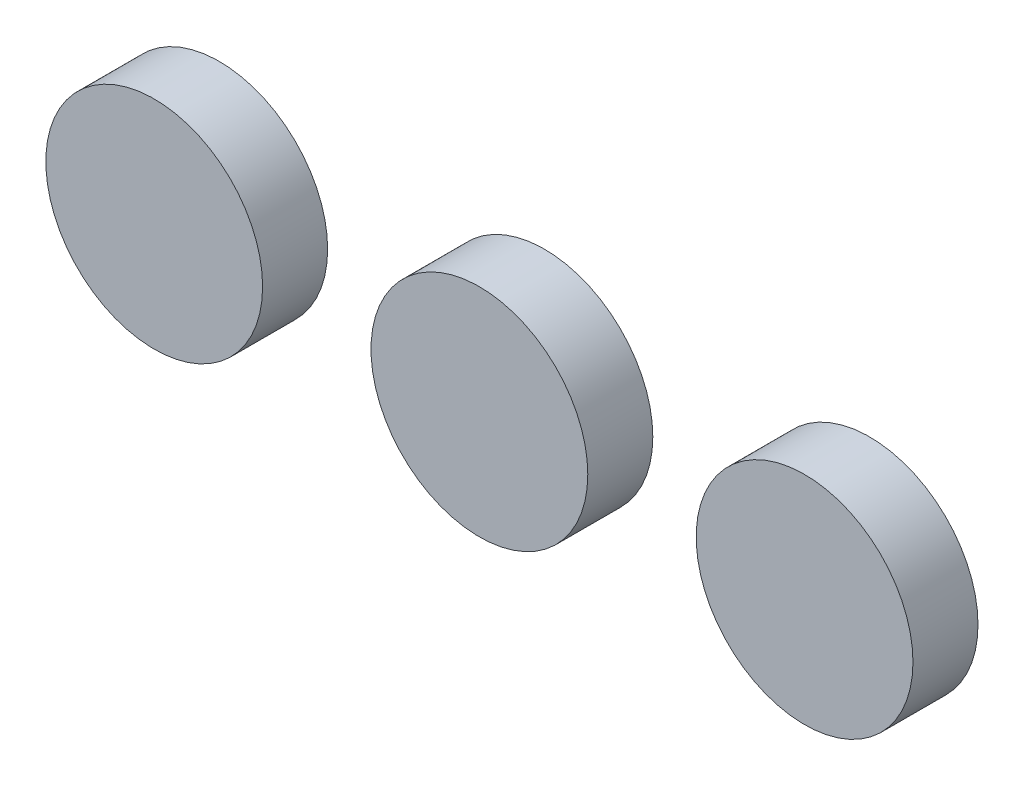
ISO-10303-21;
HEADER;
FILE_DESCRIPTION(('STEP AP214'),'2;1');
FILE_NAME('part.step','',(''),(''),'','','');
FILE_SCHEMA(('AUTOMOTIVE_DESIGN { 1 0 10303 214 1 1 1 1 }'));
ENDSEC;
DATA;
#1=APPLICATION_CONTEXT('core data for automotive mechanical design processes');
#2=APPLICATION_PROTOCOL_DEFINITION('international standard','automotive_design',2000,#1);
#3=PRODUCT_CONTEXT('',#1,'mechanical');
#4=PRODUCT('Part','Part','',(#3));
#5=PRODUCT_RELATED_PRODUCT_CATEGORY('part','',(#4));
#6=PRODUCT_DEFINITION_FORMATION('','',#4);
#7=PRODUCT_DEFINITION_CONTEXT('part definition',#1,'design');
#8=PRODUCT_DEFINITION('design','',#6,#7);
#9=PRODUCT_DEFINITION_SHAPE('','',#8);
#10=(LENGTH_UNIT() NAMED_UNIT(*) SI_UNIT(.MILLI.,.METRE.));
#11=(NAMED_UNIT(*) PLANE_ANGLE_UNIT() SI_UNIT($,.RADIAN.));
#12=(NAMED_UNIT(*) SI_UNIT($,.STERADIAN.) SOLID_ANGLE_UNIT());
#13=UNCERTAINTY_MEASURE_WITH_UNIT(LENGTH_MEASURE(1.E-05),#10,'distance_accuracy_value','');
#14=(GEOMETRIC_REPRESENTATION_CONTEXT(3) GLOBAL_UNCERTAINTY_ASSIGNED_CONTEXT((#13)) GLOBAL_UNIT_ASSIGNED_CONTEXT((#10,
#11,#12)) REPRESENTATION_CONTEXT('',''));
#15=CARTESIAN_POINT('',(0.,0.,0.));
#16=DIRECTION('',(0.,0.,1.));
#17=DIRECTION('',(1.,0.,0.));
#18=AXIS2_PLACEMENT_3D('',#15,#16,#17);
#19=CARTESIAN_POINT('',(-150.,-100.,145.));
#20=DIRECTION('',(0.,0.,1.));
#21=DIRECTION('',(1.,0.,0.));
#22=AXIS2_PLACEMENT_3D('',#19,#20,#21);
#23=CYLINDRICAL_SURFACE('',#22,50.);
#24=CARTESIAN_POINT('',(-150.,-100.,145.));
#25=DIRECTION('',(0.,0.,1.));
#26=DIRECTION('',(1.,0.,0.));
#27=AXIS2_PLACEMENT_3D('',#24,#25,#26);
#28=CIRCLE('',#27,50.);
#29=CARTESIAN_POINT('',(-99.9999999999999,-100.,145.));
#30=VERTEX_POINT('',#29);
#31=EDGE_CURVE('E11',#30,#30,#28,.T.);
#32=ORIENTED_EDGE('',*,*,#31,.T.);
#33=EDGE_LOOP('',(#32));
#34=FACE_BOUND('',#33,.T.);
#35=CARTESIAN_POINT('',(-150.,-100.,175.));
#36=DIRECTION('',(0.,0.,1.));
#37=DIRECTION('',(1.,0.,0.));
#38=AXIS2_PLACEMENT_3D('',#35,#36,#37);
#39=CIRCLE('',#38,50.);
#40=CARTESIAN_POINT('',(-99.9999999999999,-100.,175.));
#41=VERTEX_POINT('',#40);
#42=EDGE_CURVE('E50',#41,#41,#39,.T.);
#43=ORIENTED_EDGE('',*,*,#42,.F.);
#44=EDGE_LOOP('',(#43));
#45=FACE_BOUND('',#44,.T.);
#46=ADVANCED_FACE('F47',(#34,#45),#23,.T.);
#47=CARTESIAN_POINT('',(-150.,-100.,145.));
#48=DIRECTION('',(0.,0.,1.));
#49=DIRECTION('',(1.,0.,0.));
#50=AXIS2_PLACEMENT_3D('',#47,#48,#49);
#51=PLANE('',#50);
#52=ORIENTED_EDGE('',*,*,#31,.F.);
#53=EDGE_LOOP('',(#52));
#54=FACE_BOUND('',#53,.T.);
#55=ADVANCED_FACE('F62',(#54),#51,.F.);
#56=CARTESIAN_POINT('',(-150.,-100.,175.));
#57=DIRECTION('',(0.,0.,1.));
#58=DIRECTION('',(1.,0.,0.));
#59=AXIS2_PLACEMENT_3D('',#56,#57,#58);
#60=PLANE('',#59);
#61=ORIENTED_EDGE('',*,*,#42,.T.);
#62=EDGE_LOOP('',(#61));
#63=FACE_BOUND('',#62,.T.);
#64=ADVANCED_FACE('F59',(#63),#60,.T.);
#65=CLOSED_SHELL('',(#46,#55,#64));
#66=MANIFOLD_SOLID_BREP('B2',#65);
#67=CARTESIAN_POINT('',(0.,-100.,145.));
#68=DIRECTION('',(0.,0.,1.));
#69=DIRECTION('',(1.,0.,0.));
#70=AXIS2_PLACEMENT_3D('',#67,#68,#69);
#71=CYLINDRICAL_SURFACE('',#70,50.);
#72=CARTESIAN_POINT('',(0.,-100.,145.));
#73=DIRECTION('',(0.,0.,1.));
#74=DIRECTION('',(1.,0.,0.));
#75=AXIS2_PLACEMENT_3D('',#72,#73,#74);
#76=CIRCLE('',#75,50.);
#77=CARTESIAN_POINT('',(50.,-100.,145.));
#78=VERTEX_POINT('',#77);
#79=EDGE_CURVE('E46',#78,#78,#76,.T.);
#80=ORIENTED_EDGE('',*,*,#79,.T.);
#81=EDGE_LOOP('',(#80));
#82=FACE_BOUND('',#81,.T.);
#83=CARTESIAN_POINT('',(0.,-100.,175.));
#84=DIRECTION('',(0.,0.,1.));
#85=DIRECTION('',(1.,0.,0.));
#86=AXIS2_PLACEMENT_3D('',#83,#84,#85);
#87=CIRCLE('',#86,50.);
#88=CARTESIAN_POINT('',(50.,-100.,175.));
#89=VERTEX_POINT('',#88);
#90=EDGE_CURVE('E98',#89,#89,#87,.T.);
#91=ORIENTED_EDGE('',*,*,#90,.F.);
#92=EDGE_LOOP('',(#91));
#93=FACE_BOUND('',#92,.T.);
#94=ADVANCED_FACE('F95',(#82,#93),#71,.T.);
#95=CARTESIAN_POINT('',(0.,-100.,145.));
#96=DIRECTION('',(0.,0.,1.));
#97=DIRECTION('',(1.,0.,0.));
#98=AXIS2_PLACEMENT_3D('',#95,#96,#97);
#99=PLANE('',#98);
#100=ORIENTED_EDGE('',*,*,#79,.F.);
#101=EDGE_LOOP('',(#100));
#102=FACE_BOUND('',#101,.T.);
#103=ADVANCED_FACE('F112',(#102),#99,.F.);
#104=CARTESIAN_POINT('',(0.,-100.,175.));
#105=DIRECTION('',(0.,0.,1.));
#106=DIRECTION('',(1.,0.,0.));
#107=AXIS2_PLACEMENT_3D('',#104,#105,#106);
#108=PLANE('',#107);
#109=ORIENTED_EDGE('',*,*,#90,.T.);
#110=EDGE_LOOP('',(#109));
#111=FACE_BOUND('',#110,.T.);
#112=ADVANCED_FACE('F109',(#111),#108,.T.);
#113=CLOSED_SHELL('',(#94,#103,#112));
#114=MANIFOLD_SOLID_BREP('B6',#113);
#115=CARTESIAN_POINT('',(150.,-100.,145.));
#116=DIRECTION('',(0.,0.,1.));
#117=DIRECTION('',(1.,0.,0.));
#118=AXIS2_PLACEMENT_3D('',#115,#116,#117);
#119=CYLINDRICAL_SURFACE('',#118,50.);
#120=CARTESIAN_POINT('',(150.,-100.,145.));
#121=DIRECTION('',(0.,0.,1.));
#122=DIRECTION('',(1.,0.,0.));
#123=AXIS2_PLACEMENT_3D('',#120,#121,#122);
#124=CIRCLE('',#123,50.);
#125=CARTESIAN_POINT('',(200.,-100.,145.));
#126=VERTEX_POINT('',#125);
#127=EDGE_CURVE('E94',#126,#126,#124,.T.);
#128=ORIENTED_EDGE('',*,*,#127,.T.);
#129=EDGE_LOOP('',(#128));
#130=FACE_BOUND('',#129,.T.);
#131=CARTESIAN_POINT('',(150.,-100.,175.));
#132=DIRECTION('',(0.,0.,1.));
#133=DIRECTION('',(1.,0.,0.));
#134=AXIS2_PLACEMENT_3D('',#131,#132,#133);
#135=CIRCLE('',#134,50.);
#136=CARTESIAN_POINT('',(200.,-100.,175.));
#137=VERTEX_POINT('',#136);
#138=EDGE_CURVE('E140',#137,#137,#135,.T.);
#139=ORIENTED_EDGE('',*,*,#138,.F.);
#140=EDGE_LOOP('',(#139));
#141=FACE_BOUND('',#140,.T.);
#142=ADVANCED_FACE('F137',(#130,#141),#119,.T.);
#143=CARTESIAN_POINT('',(150.,-100.,145.));
#144=DIRECTION('',(0.,0.,1.));
#145=DIRECTION('',(1.,0.,0.));
#146=AXIS2_PLACEMENT_3D('',#143,#144,#145);
#147=PLANE('',#146);
#148=ORIENTED_EDGE('',*,*,#127,.F.);
#149=EDGE_LOOP('',(#148));
#150=FACE_BOUND('',#149,.T.);
#151=ADVANCED_FACE('F152',(#150),#147,.F.);
#152=CARTESIAN_POINT('',(150.,-100.,175.));
#153=DIRECTION('',(0.,0.,1.));
#154=DIRECTION('',(1.,0.,0.));
#155=AXIS2_PLACEMENT_3D('',#152,#153,#154);
#156=PLANE('',#155);
#157=ORIENTED_EDGE('',*,*,#138,.T.);
#158=EDGE_LOOP('',(#157));
#159=FACE_BOUND('',#158,.T.);
#160=ADVANCED_FACE('F149',(#159),#156,.T.);
#161=CLOSED_SHELL('',(#142,#151,#160));
#162=MANIFOLD_SOLID_BREP('B41',#161);
#163=ADVANCED_BREP_SHAPE_REPRESENTATION('',(#18,#66,#114,#162),#14);
#164=SHAPE_DEFINITION_REPRESENTATION(#9,#163);
ENDSEC;
END-ISO-10303-21;
